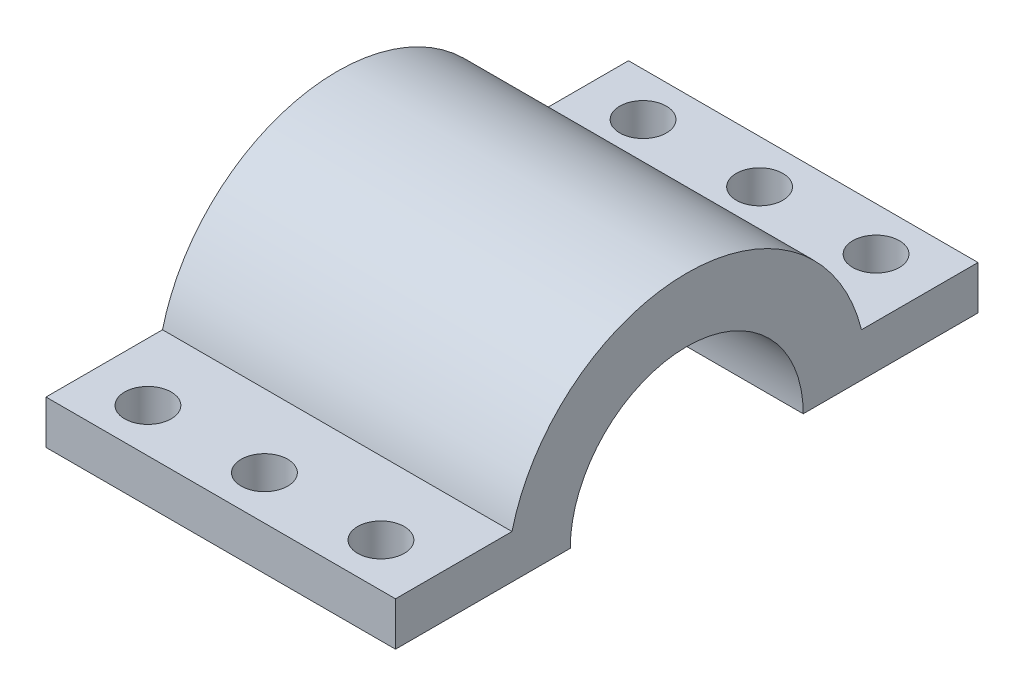
ISO-10303-21;
HEADER;
FILE_DESCRIPTION(('STEP AP214'),'2;1');
FILE_NAME('part.step','',(''),(''),'','','');
FILE_SCHEMA(('AUTOMOTIVE_DESIGN { 1 0 10303 214 1 1 1 1 }'));
ENDSEC;
DATA;
#1=APPLICATION_CONTEXT('core data for automotive mechanical design processes');
#2=APPLICATION_PROTOCOL_DEFINITION('international standard','automotive_design',2000,#1);
#3=PRODUCT_CONTEXT('',#1,'mechanical');
#4=PRODUCT('Part','Part','',(#3));
#5=PRODUCT_RELATED_PRODUCT_CATEGORY('part','',(#4));
#6=PRODUCT_DEFINITION_FORMATION('','',#4);
#7=PRODUCT_DEFINITION_CONTEXT('part definition',#1,'design');
#8=PRODUCT_DEFINITION('design','',#6,#7);
#9=PRODUCT_DEFINITION_SHAPE('','',#8);
#10=(LENGTH_UNIT() NAMED_UNIT(*) SI_UNIT(.MILLI.,.METRE.));
#11=(NAMED_UNIT(*) PLANE_ANGLE_UNIT() SI_UNIT($,.RADIAN.));
#12=(NAMED_UNIT(*) SI_UNIT($,.STERADIAN.) SOLID_ANGLE_UNIT());
#13=UNCERTAINTY_MEASURE_WITH_UNIT(LENGTH_MEASURE(1.E-05),#10,'distance_accuracy_value','');
#14=(GEOMETRIC_REPRESENTATION_CONTEXT(3) GLOBAL_UNCERTAINTY_ASSIGNED_CONTEXT((#13)) GLOBAL_UNIT_ASSIGNED_CONTEXT((#10,
#11,#12)) REPRESENTATION_CONTEXT('',''));
#15=CARTESIAN_POINT('',(0.,0.,0.));
#16=DIRECTION('',(0.,0.,1.));
#17=DIRECTION('',(1.,0.,0.));
#18=AXIS2_PLACEMENT_3D('',#15,#16,#17);
#19=CARTESIAN_POINT('',(-4.,-20.,0.));
#20=DIRECTION('',(-1.,0.,0.));
#21=DIRECTION('',(0.,0.,1.));
#22=AXIS2_PLACEMENT_3D('',#19,#20,#21);
#23=PLANE('',#22);
#24=CARTESIAN_POINT('',(-4.,-38.,-8.));
#25=DIRECTION('',(1.,0.,0.));
#26=DIRECTION('',(0.,0.,1.));
#27=AXIS2_PLACEMENT_3D('',#24,#25,#26);
#28=CIRCLE('',#27,12.369316876853);
#29=CARTESIAN_POINT('',(-4.,-35.,-20.));
#30=VERTEX_POINT('',#29);
#31=CARTESIAN_POINT('',(-4.,-35.,4.));
#32=VERTEX_POINT('',#31);
#33=EDGE_CURVE('E118',#30,#32,#28,.T.);
#34=ORIENTED_EDGE('',*,*,#33,.F.);
#35=DIRECTION('',(0.,0.,1.));
#36=VECTOR('',#35,1.);
#37=CARTESIAN_POINT('',(-4.,-35.,0.));
#38=LINE('',#37,#36);
#39=CARTESIAN_POINT('',(-4.,-35.,-28.));
#40=VERTEX_POINT('',#39);
#41=EDGE_CURVE('E202',#40,#30,#38,.T.);
#42=ORIENTED_EDGE('',*,*,#41,.F.);
#43=DIRECTION('',(0.,1.,0.));
#44=VECTOR('',#43,1.);
#45=CARTESIAN_POINT('',(-4.,0.,-28.));
#46=LINE('',#45,#44);
#47=CARTESIAN_POINT('',(-4.,-38.,-28.));
#48=VERTEX_POINT('',#47);
#49=EDGE_CURVE('E198',#48,#40,#46,.T.);
#50=ORIENTED_EDGE('',*,*,#49,.F.);
#51=DIRECTION('',(0.,0.,1.));
#52=VECTOR('',#51,1.);
#53=CARTESIAN_POINT('',(-4.,-38.,0.));
#54=LINE('',#53,#52);
#55=CARTESIAN_POINT('',(-4.,-38.,-16.));
#56=VERTEX_POINT('',#55);
#57=EDGE_CURVE('E151',#48,#56,#54,.T.);
#58=ORIENTED_EDGE('',*,*,#57,.T.);
#59=CARTESIAN_POINT('',(-4.,-38.,-8.));
#60=DIRECTION('',(-1.,0.,0.));
#61=DIRECTION('',(0.,0.,1.));
#62=AXIS2_PLACEMENT_3D('',#59,#60,#61);
#63=CIRCLE('',#62,8.);
#64=CARTESIAN_POINT('',(-4.,-38.,0.));
#65=VERTEX_POINT('',#64);
#66=EDGE_CURVE('E154',#65,#56,#63,.T.);
#67=ORIENTED_EDGE('',*,*,#66,.F.);
#68=DIRECTION('',(0.,0.,1.));
#69=VECTOR('',#68,1.);
#70=CARTESIAN_POINT('',(-4.,-38.,-1.31838984174237E-13));
#71=LINE('',#70,#69);
#72=CARTESIAN_POINT('',(-4.,-38.,12.));
#73=VERTEX_POINT('',#72);
#74=EDGE_CURVE('E140',#65,#73,#71,.T.);
#75=ORIENTED_EDGE('',*,*,#74,.T.);
#76=DIRECTION('',(0.,1.,0.));
#77=VECTOR('',#76,1.);
#78=CARTESIAN_POINT('',(-4.,0.,12.));
#79=LINE('',#78,#77);
#80=CARTESIAN_POINT('',(-4.,-35.,12.));
#81=VERTEX_POINT('',#80);
#82=EDGE_CURVE('E146',#73,#81,#79,.T.);
#83=ORIENTED_EDGE('',*,*,#82,.T.);
#84=DIRECTION('',(0.,0.,-1.));
#85=VECTOR('',#84,1.);
#86=CARTESIAN_POINT('',(-4.,-35.,0.));
#87=LINE('',#86,#85);
#88=EDGE_CURVE('E150',#81,#32,#87,.T.);
#89=ORIENTED_EDGE('',*,*,#88,.T.);
#90=EDGE_LOOP('',(#34,#42,#50,#58,#67,#75,#83,#89));
#91=FACE_BOUND('',#90,.T.);
#92=ADVANCED_FACE('F40',(#91),#23,.T.);
#93=CARTESIAN_POINT('',(20.,-20.,0.));
#94=DIRECTION('',(1.,0.,0.));
#95=DIRECTION('',(0.,0.,-1.));
#96=AXIS2_PLACEMENT_3D('',#93,#94,#95);
#97=PLANE('',#96);
#98=CARTESIAN_POINT('',(20.,-38.,-8.));
#99=DIRECTION('',(1.,0.,0.));
#100=DIRECTION('',(0.,0.,1.));
#101=AXIS2_PLACEMENT_3D('',#98,#99,#100);
#102=CIRCLE('',#101,12.369316876853);
#103=CARTESIAN_POINT('',(20.,-35.,-20.));
#104=VERTEX_POINT('',#103);
#105=CARTESIAN_POINT('',(20.,-35.,4.));
#106=VERTEX_POINT('',#105);
#107=EDGE_CURVE('E115',#104,#106,#102,.T.);
#108=ORIENTED_EDGE('',*,*,#107,.T.);
#109=DIRECTION('',(0.,0.,-1.));
#110=VECTOR('',#109,1.);
#111=CARTESIAN_POINT('',(20.,-35.,0.));
#112=LINE('',#111,#110);
#113=CARTESIAN_POINT('',(20.,-35.,12.));
#114=VERTEX_POINT('',#113);
#115=EDGE_CURVE('E124',#114,#106,#112,.T.);
#116=ORIENTED_EDGE('',*,*,#115,.F.);
#117=DIRECTION('',(0.,1.,0.));
#118=VECTOR('',#117,1.);
#119=CARTESIAN_POINT('',(20.,0.,12.));
#120=LINE('',#119,#118);
#121=CARTESIAN_POINT('',(20.,-38.,12.));
#122=VERTEX_POINT('',#121);
#123=EDGE_CURVE('E134',#122,#114,#120,.T.);
#124=ORIENTED_EDGE('',*,*,#123,.F.);
#125=DIRECTION('',(0.,0.,1.));
#126=VECTOR('',#125,1.);
#127=CARTESIAN_POINT('',(20.,-38.,-1.31838984174237E-13));
#128=LINE('',#127,#126);
#129=CARTESIAN_POINT('',(20.,-38.,0.));
#130=VERTEX_POINT('',#129);
#131=EDGE_CURVE('E138',#130,#122,#128,.T.);
#132=ORIENTED_EDGE('',*,*,#131,.F.);
#133=CARTESIAN_POINT('',(20.,-38.,-8.));
#134=DIRECTION('',(-1.,0.,0.));
#135=DIRECTION('',(0.,0.,1.));
#136=AXIS2_PLACEMENT_3D('',#133,#134,#135);
#137=CIRCLE('',#136,8.);
#138=CARTESIAN_POINT('',(20.,-38.,-16.));
#139=VERTEX_POINT('',#138);
#140=EDGE_CURVE('E133',#130,#139,#137,.T.);
#141=ORIENTED_EDGE('',*,*,#140,.T.);
#142=DIRECTION('',(0.,0.,1.));
#143=VECTOR('',#142,1.);
#144=CARTESIAN_POINT('',(20.,-38.,0.));
#145=LINE('',#144,#143);
#146=CARTESIAN_POINT('',(20.,-38.,-28.));
#147=VERTEX_POINT('',#146);
#148=EDGE_CURVE('E187',#147,#139,#145,.T.);
#149=ORIENTED_EDGE('',*,*,#148,.F.);
#150=DIRECTION('',(0.,1.,0.));
#151=VECTOR('',#150,1.);
#152=CARTESIAN_POINT('',(20.,0.,-28.));
#153=LINE('',#152,#151);
#154=CARTESIAN_POINT('',(20.,-35.,-28.));
#155=VERTEX_POINT('',#154);
#156=EDGE_CURVE('E204',#147,#155,#153,.T.);
#157=ORIENTED_EDGE('',*,*,#156,.T.);
#158=DIRECTION('',(0.,0.,1.));
#159=VECTOR('',#158,1.);
#160=CARTESIAN_POINT('',(20.,-35.,0.));
#161=LINE('',#160,#159);
#162=EDGE_CURVE('E126',#155,#104,#161,.T.);
#163=ORIENTED_EDGE('',*,*,#162,.T.);
#164=EDGE_LOOP('',(#108,#116,#124,#132,#141,#149,#157,#163));
#165=FACE_BOUND('',#164,.T.);
#166=ADVANCED_FACE('F123',(#165),#97,.T.);
#167=CARTESIAN_POINT('',(20.,0.,12.));
#168=DIRECTION('',(0.,0.,1.));
#169=DIRECTION('',(1.,0.,0.));
#170=AXIS2_PLACEMENT_3D('',#167,#168,#169);
#171=PLANE('',#170);
#172=ORIENTED_EDGE('',*,*,#82,.F.);
#173=DIRECTION('',(-1.,0.,0.));
#174=VECTOR('',#173,1.);
#175=CARTESIAN_POINT('',(20.,-38.,12.));
#176=LINE('',#175,#174);
#177=EDGE_CURVE('E11',#122,#73,#176,.T.);
#178=ORIENTED_EDGE('',*,*,#177,.F.);
#179=ORIENTED_EDGE('',*,*,#123,.T.);
#180=DIRECTION('',(-1.,0.,0.));
#181=VECTOR('',#180,1.);
#182=CARTESIAN_POINT('',(20.,-35.,12.));
#183=LINE('',#182,#181);
#184=EDGE_CURVE('E80',#114,#81,#183,.T.);
#185=ORIENTED_EDGE('',*,*,#184,.T.);
#186=EDGE_LOOP('',(#172,#178,#179,#185));
#187=FACE_BOUND('',#186,.T.);
#188=ADVANCED_FACE('F267',(#187),#171,.T.);
#189=CARTESIAN_POINT('',(20.,-38.,-1.31838984174237E-13));
#190=DIRECTION('',(0.,-1.,0.));
#191=DIRECTION('',(0.,0.,-1.));
#192=AXIS2_PLACEMENT_3D('',#189,#190,#191);
#193=PLANE('',#192);
#194=CARTESIAN_POINT('',(16.,-38.,9.00000000000006));
#195=DIRECTION('',(0.,-1.,0.));
#196=DIRECTION('',(0.,0.,-1.));
#197=AXIS2_PLACEMENT_3D('',#194,#195,#196);
#198=CIRCLE('',#197,1.6);
#199=CARTESIAN_POINT('',(16.,-38.,7.40000000000006));
#200=VERTEX_POINT('',#199);
#201=EDGE_CURVE('E233',#200,#200,#198,.T.);
#202=ORIENTED_EDGE('',*,*,#201,.F.);
#203=EDGE_LOOP('',(#202));
#204=FACE_BOUND('',#203,.T.);
#205=CARTESIAN_POINT('',(0.,-38.,9.00000000000006));
#206=DIRECTION('',(0.,-1.,0.));
#207=DIRECTION('',(0.,0.,1.));
#208=AXIS2_PLACEMENT_3D('',#205,#206,#207);
#209=CIRCLE('',#208,1.6);
#210=CARTESIAN_POINT('',(0.,-38.,10.6000000000001));
#211=VERTEX_POINT('',#210);
#212=EDGE_CURVE('E242',#211,#211,#209,.T.);
#213=ORIENTED_EDGE('',*,*,#212,.F.);
#214=EDGE_LOOP('',(#213));
#215=FACE_BOUND('',#214,.T.);
#216=CARTESIAN_POINT('',(8.,-38.,9.));
#217=DIRECTION('',(0.,-1.,0.));
#218=DIRECTION('',(0.,0.,-1.));
#219=AXIS2_PLACEMENT_3D('',#216,#217,#218);
#220=CIRCLE('',#219,1.6);
#221=CARTESIAN_POINT('',(8.,-38.,7.4));
#222=VERTEX_POINT('',#221);
#223=EDGE_CURVE('E169',#222,#222,#220,.T.);
#224=ORIENTED_EDGE('',*,*,#223,.F.);
#225=EDGE_LOOP('',(#224));
#226=FACE_BOUND('',#225,.T.);
#227=ORIENTED_EDGE('',*,*,#74,.F.);
#228=DIRECTION('',(-1.,0.,0.));
#229=VECTOR('',#228,1.);
#230=CARTESIAN_POINT('',(20.,-38.,0.));
#231=LINE('',#230,#229);
#232=EDGE_CURVE('E50',#130,#65,#231,.T.);
#233=ORIENTED_EDGE('',*,*,#232,.F.);
#234=ORIENTED_EDGE('',*,*,#131,.T.);
#235=ORIENTED_EDGE('',*,*,#177,.T.);
#236=EDGE_LOOP('',(#227,#233,#234,#235));
#237=FACE_BOUND('',#236,.T.);
#238=ADVANCED_FACE('F266',(#204,#215,#226,#237),#193,.T.);
#239=CARTESIAN_POINT('',(20.,-38.,-8.));
#240=DIRECTION('',(-1.,0.,0.));
#241=DIRECTION('',(0.,0.,1.));
#242=AXIS2_PLACEMENT_3D('',#239,#240,#241);
#243=CYLINDRICAL_SURFACE('',#242,8.);
#244=ORIENTED_EDGE('',*,*,#66,.T.);
#245=DIRECTION('',(-1.,0.,0.));
#246=VECTOR('',#245,1.);
#247=CARTESIAN_POINT('',(20.,-38.,-16.));
#248=LINE('',#247,#246);
#249=EDGE_CURVE('E192',#139,#56,#248,.T.);
#250=ORIENTED_EDGE('',*,*,#249,.F.);
#251=ORIENTED_EDGE('',*,*,#140,.F.);
#252=ORIENTED_EDGE('',*,*,#232,.T.);
#253=EDGE_LOOP('',(#244,#250,#251,#252));
#254=FACE_BOUND('',#253,.T.);
#255=ADVANCED_FACE('F264',(#254),#243,.F.);
#256=CARTESIAN_POINT('',(20.,-35.,0.));
#257=DIRECTION('',(0.,1.,0.));
#258=DIRECTION('',(0.,0.,1.));
#259=AXIS2_PLACEMENT_3D('',#256,#257,#258);
#260=PLANE('',#259);
#261=CARTESIAN_POINT('',(16.,-35.,9.00000000000007));
#262=DIRECTION('',(0.,1.,0.));
#263=DIRECTION('',(0.,0.,1.));
#264=AXIS2_PLACEMENT_3D('',#261,#262,#263);
#265=CIRCLE('',#264,1.6);
#266=CARTESIAN_POINT('',(16.,-35.,10.6000000000001));
#267=VERTEX_POINT('',#266);
#268=EDGE_CURVE('E43',#267,#267,#265,.T.);
#269=ORIENTED_EDGE('',*,*,#268,.F.);
#270=EDGE_LOOP('',(#269));
#271=FACE_BOUND('',#270,.T.);
#272=CARTESIAN_POINT('',(0.,-35.,9.00000000000007));
#273=DIRECTION('',(0.,1.,0.));
#274=DIRECTION('',(0.,0.,1.));
#275=AXIS2_PLACEMENT_3D('',#272,#273,#274);
#276=CIRCLE('',#275,1.6);
#277=CARTESIAN_POINT('',(0.,-35.,10.6000000000001));
#278=VERTEX_POINT('',#277);
#279=EDGE_CURVE('E180',#278,#278,#276,.T.);
#280=ORIENTED_EDGE('',*,*,#279,.F.);
#281=EDGE_LOOP('',(#280));
#282=FACE_BOUND('',#281,.T.);
#283=CARTESIAN_POINT('',(8.,-35.,9.00000000000001));
#284=DIRECTION('',(0.,1.,0.));
#285=DIRECTION('',(0.,0.,1.));
#286=AXIS2_PLACEMENT_3D('',#283,#284,#285);
#287=CIRCLE('',#286,1.6);
#288=CARTESIAN_POINT('',(8.,-35.,10.6));
#289=VERTEX_POINT('',#288);
#290=EDGE_CURVE('E177',#289,#289,#287,.T.);
#291=ORIENTED_EDGE('',*,*,#290,.F.);
#292=EDGE_LOOP('',(#291));
#293=FACE_BOUND('',#292,.T.);
#294=ORIENTED_EDGE('',*,*,#88,.F.);
#295=ORIENTED_EDGE('',*,*,#184,.F.);
#296=ORIENTED_EDGE('',*,*,#115,.T.);
#297=DIRECTION('',(-1.,0.,0.));
#298=VECTOR('',#297,1.);
#299=CARTESIAN_POINT('',(20.,-35.,4.));
#300=LINE('',#299,#298);
#301=EDGE_CURVE('E112',#106,#32,#300,.T.);
#302=ORIENTED_EDGE('',*,*,#301,.T.);
#303=EDGE_LOOP('',(#294,#295,#296,#302));
#304=FACE_BOUND('',#303,.T.);
#305=ADVANCED_FACE('F131',(#271,#282,#293,#304),#260,.T.);
#306=CARTESIAN_POINT('',(20.,-38.,0.));
#307=DIRECTION('',(0.,-1.,0.));
#308=DIRECTION('',(0.,0.,-1.));
#309=AXIS2_PLACEMENT_3D('',#306,#307,#308);
#310=PLANE('',#309);
#311=CARTESIAN_POINT('',(0.,-37.9999999999999,-25.0000000000001));
#312=DIRECTION('',(0.,-1.,0.));
#313=DIRECTION('',(0.,0.,-1.));
#314=AXIS2_PLACEMENT_3D('',#311,#312,#313);
#315=CIRCLE('',#314,1.6);
#316=CARTESIAN_POINT('',(0.,-37.9999999999999,-26.6000000000001));
#317=VERTEX_POINT('',#316);
#318=EDGE_CURVE('E238',#317,#317,#315,.T.);
#319=ORIENTED_EDGE('',*,*,#318,.F.);
#320=EDGE_LOOP('',(#319));
#321=FACE_BOUND('',#320,.T.);
#322=CARTESIAN_POINT('',(8.,-37.9999999999999,-25.));
#323=DIRECTION('',(0.,-1.,0.));
#324=DIRECTION('',(0.,0.,1.));
#325=AXIS2_PLACEMENT_3D('',#322,#323,#324);
#326=CIRCLE('',#325,1.6);
#327=CARTESIAN_POINT('',(8.,-37.9999999999999,-23.4));
#328=VERTEX_POINT('',#327);
#329=EDGE_CURVE('E234',#328,#328,#326,.T.);
#330=ORIENTED_EDGE('',*,*,#329,.F.);
#331=EDGE_LOOP('',(#330));
#332=FACE_BOUND('',#331,.T.);
#333=CARTESIAN_POINT('',(16.,-37.9999999999999,-25.0000000000001));
#334=DIRECTION('',(0.,-1.,0.));
#335=DIRECTION('',(0.,0.,1.));
#336=AXIS2_PLACEMENT_3D('',#333,#334,#335);
#337=CIRCLE('',#336,1.6);
#338=CARTESIAN_POINT('',(16.,-37.9999999999999,-23.4000000000001));
#339=VERTEX_POINT('',#338);
#340=EDGE_CURVE('E129',#339,#339,#337,.T.);
#341=ORIENTED_EDGE('',*,*,#340,.F.);
#342=EDGE_LOOP('',(#341));
#343=FACE_BOUND('',#342,.T.);
#344=ORIENTED_EDGE('',*,*,#57,.F.);
#345=DIRECTION('',(-1.,0.,0.));
#346=VECTOR('',#345,1.);
#347=CARTESIAN_POINT('',(20.,-38.,-28.));
#348=LINE('',#347,#346);
#349=EDGE_CURVE('E216',#147,#48,#348,.T.);
#350=ORIENTED_EDGE('',*,*,#349,.F.);
#351=ORIENTED_EDGE('',*,*,#148,.T.);
#352=ORIENTED_EDGE('',*,*,#249,.T.);
#353=EDGE_LOOP('',(#344,#350,#351,#352));
#354=FACE_BOUND('',#353,.T.);
#355=ADVANCED_FACE('F258',(#321,#332,#343,#354),#310,.T.);
#356=CARTESIAN_POINT('',(20.,0.,-28.));
#357=DIRECTION('',(0.,0.,1.));
#358=DIRECTION('',(1.,0.,0.));
#359=AXIS2_PLACEMENT_3D('',#356,#357,#358);
#360=PLANE('',#359);
#361=ORIENTED_EDGE('',*,*,#49,.T.);
#362=DIRECTION('',(-1.,0.,0.));
#363=VECTOR('',#362,1.);
#364=CARTESIAN_POINT('',(20.,-35.,-28.));
#365=LINE('',#364,#363);
#366=EDGE_CURVE('E224',#155,#40,#365,.T.);
#367=ORIENTED_EDGE('',*,*,#366,.F.);
#368=ORIENTED_EDGE('',*,*,#156,.F.);
#369=ORIENTED_EDGE('',*,*,#349,.T.);
#370=EDGE_LOOP('',(#361,#367,#368,#369));
#371=FACE_BOUND('',#370,.T.);
#372=ADVANCED_FACE('F260',(#371),#360,.F.);
#373=CARTESIAN_POINT('',(20.,-35.,0.));
#374=DIRECTION('',(0.,-1.,0.));
#375=DIRECTION('',(0.,0.,-1.));
#376=AXIS2_PLACEMENT_3D('',#373,#374,#375);
#377=PLANE('',#376);
#378=CARTESIAN_POINT('',(0.,-35.,-25.0000000000001));
#379=DIRECTION('',(0.,-1.,0.));
#380=DIRECTION('',(0.,0.,-1.));
#381=AXIS2_PLACEMENT_3D('',#378,#379,#380);
#382=CIRCLE('',#381,1.6);
#383=CARTESIAN_POINT('',(0.,-35.,-26.6000000000001));
#384=VERTEX_POINT('',#383);
#385=EDGE_CURVE('E173',#384,#384,#382,.T.);
#386=ORIENTED_EDGE('',*,*,#385,.T.);
#387=EDGE_LOOP('',(#386));
#388=FACE_BOUND('',#387,.T.);
#389=CARTESIAN_POINT('',(8.,-35.,-25.));
#390=DIRECTION('',(0.,-1.,0.));
#391=DIRECTION('',(0.,0.,-1.));
#392=AXIS2_PLACEMENT_3D('',#389,#390,#391);
#393=CIRCLE('',#392,1.6);
#394=CARTESIAN_POINT('',(8.,-35.,-26.6));
#395=VERTEX_POINT('',#394);
#396=EDGE_CURVE('E168',#395,#395,#393,.T.);
#397=ORIENTED_EDGE('',*,*,#396,.T.);
#398=EDGE_LOOP('',(#397));
#399=FACE_BOUND('',#398,.T.);
#400=CARTESIAN_POINT('',(16.,-35.,-25.0000000000001));
#401=DIRECTION('',(0.,-1.,0.));
#402=DIRECTION('',(0.,0.,-1.));
#403=AXIS2_PLACEMENT_3D('',#400,#401,#402);
#404=CIRCLE('',#403,1.6);
#405=CARTESIAN_POINT('',(16.,-35.,-26.6000000000001));
#406=VERTEX_POINT('',#405);
#407=EDGE_CURVE('E164',#406,#406,#404,.T.);
#408=ORIENTED_EDGE('',*,*,#407,.T.);
#409=EDGE_LOOP('',(#408));
#410=FACE_BOUND('',#409,.T.);
#411=ORIENTED_EDGE('',*,*,#41,.T.);
#412=DIRECTION('',(-1.,0.,0.));
#413=VECTOR('',#412,1.);
#414=CARTESIAN_POINT('',(20.,-35.,-20.));
#415=LINE('',#414,#413);
#416=EDGE_CURVE('E206',#104,#30,#415,.T.);
#417=ORIENTED_EDGE('',*,*,#416,.F.);
#418=ORIENTED_EDGE('',*,*,#162,.F.);
#419=ORIENTED_EDGE('',*,*,#366,.T.);
#420=EDGE_LOOP('',(#411,#417,#418,#419));
#421=FACE_BOUND('',#420,.T.);
#422=ADVANCED_FACE('F270',(#388,#399,#410,#421),#377,.F.);
#423=CARTESIAN_POINT('',(16.,-13.9999999999999,-25.));
#424=DIRECTION('',(0.,-1.,0.));
#425=DIRECTION('',(0.,0.,-1.));
#426=AXIS2_PLACEMENT_3D('',#423,#424,#425);
#427=CYLINDRICAL_SURFACE('',#426,1.6);
#428=ORIENTED_EDGE('',*,*,#340,.T.);
#429=EDGE_LOOP('',(#428));
#430=FACE_BOUND('',#429,.T.);
#431=ORIENTED_EDGE('',*,*,#407,.F.);
#432=EDGE_LOOP('',(#431));
#433=FACE_BOUND('',#432,.T.);
#434=ADVANCED_FACE('F255',(#430,#433),#427,.F.);
#435=CARTESIAN_POINT('',(8.,-13.9999999999999,-24.9999999999999));
#436=DIRECTION('',(0.,-1.,0.));
#437=DIRECTION('',(0.,0.,-1.));
#438=AXIS2_PLACEMENT_3D('',#435,#436,#437);
#439=CYLINDRICAL_SURFACE('',#438,1.6);
#440=ORIENTED_EDGE('',*,*,#329,.T.);
#441=EDGE_LOOP('',(#440));
#442=FACE_BOUND('',#441,.T.);
#443=ORIENTED_EDGE('',*,*,#396,.F.);
#444=EDGE_LOOP('',(#443));
#445=FACE_BOUND('',#444,.T.);
#446=ADVANCED_FACE('F314',(#442,#445),#439,.F.);
#447=CARTESIAN_POINT('',(0.,-13.9999999999999,-25.));
#448=DIRECTION('',(0.,-1.,0.));
#449=DIRECTION('',(0.,0.,-1.));
#450=AXIS2_PLACEMENT_3D('',#447,#448,#449);
#451=CYLINDRICAL_SURFACE('',#450,1.6);
#452=ORIENTED_EDGE('',*,*,#318,.T.);
#453=EDGE_LOOP('',(#452));
#454=FACE_BOUND('',#453,.T.);
#455=ORIENTED_EDGE('',*,*,#385,.F.);
#456=EDGE_LOOP('',(#455));
#457=FACE_BOUND('',#456,.T.);
#458=ADVANCED_FACE('F305',(#454,#457),#451,.F.);
#459=CARTESIAN_POINT('',(8.,-14.,9.00000000000008));
#460=DIRECTION('',(0.,-1.,0.));
#461=DIRECTION('',(0.,0.,-1.));
#462=AXIS2_PLACEMENT_3D('',#459,#460,#461);
#463=CYLINDRICAL_SURFACE('',#462,1.6);
#464=ORIENTED_EDGE('',*,*,#290,.T.);
#465=EDGE_LOOP('',(#464));
#466=FACE_BOUND('',#465,.T.);
#467=ORIENTED_EDGE('',*,*,#223,.T.);
#468=EDGE_LOOP('',(#467));
#469=FACE_BOUND('',#468,.T.);
#470=ADVANCED_FACE('F302',(#466,#469),#463,.F.);
#471=CARTESIAN_POINT('',(0.,-14.,9.00000000000015));
#472=DIRECTION('',(0.,-1.,0.));
#473=DIRECTION('',(0.,0.,-1.));
#474=AXIS2_PLACEMENT_3D('',#471,#472,#473);
#475=CYLINDRICAL_SURFACE('',#474,1.6);
#476=ORIENTED_EDGE('',*,*,#279,.T.);
#477=EDGE_LOOP('',(#476));
#478=FACE_BOUND('',#477,.T.);
#479=ORIENTED_EDGE('',*,*,#212,.T.);
#480=EDGE_LOOP('',(#479));
#481=FACE_BOUND('',#480,.T.);
#482=ADVANCED_FACE('F304',(#478,#481),#475,.F.);
#483=CARTESIAN_POINT('',(16.,-14.,9.00000000000015));
#484=DIRECTION('',(0.,-1.,0.));
#485=DIRECTION('',(0.,0.,-1.));
#486=AXIS2_PLACEMENT_3D('',#483,#484,#485);
#487=CYLINDRICAL_SURFACE('',#486,1.6);
#488=ORIENTED_EDGE('',*,*,#268,.T.);
#489=EDGE_LOOP('',(#488));
#490=FACE_BOUND('',#489,.T.);
#491=ORIENTED_EDGE('',*,*,#201,.T.);
#492=EDGE_LOOP('',(#491));
#493=FACE_BOUND('',#492,.T.);
#494=ADVANCED_FACE('F312',(#490,#493),#487,.F.);
#495=CARTESIAN_POINT('',(20.,-38.,-8.));
#496=DIRECTION('',(-1.,0.,0.));
#497=DIRECTION('',(0.,0.,1.));
#498=AXIS2_PLACEMENT_3D('',#495,#496,#497);
#499=CYLINDRICAL_SURFACE('',#498,12.369316876853);
#500=ORIENTED_EDGE('',*,*,#33,.T.);
#501=ORIENTED_EDGE('',*,*,#301,.F.);
#502=ORIENTED_EDGE('',*,*,#107,.F.);
#503=ORIENTED_EDGE('',*,*,#416,.T.);
#504=EDGE_LOOP('',(#500,#501,#502,#503));
#505=FACE_BOUND('',#504,.T.);
#506=ADVANCED_FACE('F114',(#505),#499,.T.);
#507=CLOSED_SHELL('',(#92,#166,#188,#238,#255,#305,#355,#372,#422,#434,#446,#458,#470,#482,#494,#506));
#508=MANIFOLD_SOLID_BREP('B2',#507);
#509=ADVANCED_BREP_SHAPE_REPRESENTATION('',(#18,#508),#14);
#510=SHAPE_DEFINITION_REPRESENTATION(#9,#509);
ENDSEC;
END-ISO-10303-21;
